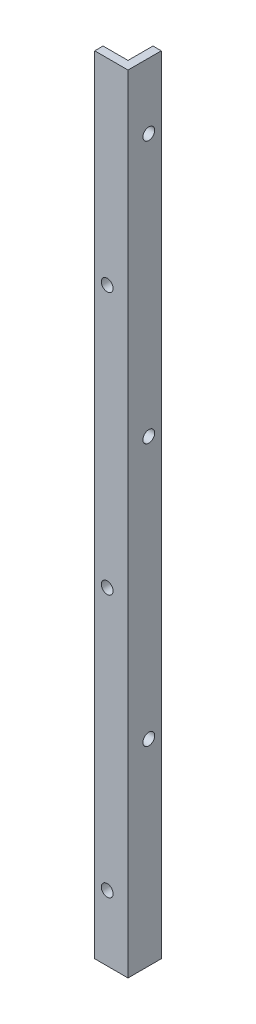
ISO-10303-21;
HEADER;
FILE_DESCRIPTION(('STEP AP214'),'2;1');
FILE_NAME('part.step','',(''),(''),'','','');
FILE_SCHEMA(('AUTOMOTIVE_DESIGN { 1 0 10303 214 1 1 1 1 }'));
ENDSEC;
DATA;
#1=APPLICATION_CONTEXT('core data for automotive mechanical design processes');
#2=APPLICATION_PROTOCOL_DEFINITION('international standard','automotive_design',2000,#1);
#3=PRODUCT_CONTEXT('',#1,'mechanical');
#4=PRODUCT('Part','Part','',(#3));
#5=PRODUCT_RELATED_PRODUCT_CATEGORY('part','',(#4));
#6=PRODUCT_DEFINITION_FORMATION('','',#4);
#7=PRODUCT_DEFINITION_CONTEXT('part definition',#1,'design');
#8=PRODUCT_DEFINITION('design','',#6,#7);
#9=PRODUCT_DEFINITION_SHAPE('','',#8);
#10=(LENGTH_UNIT() NAMED_UNIT(*) SI_UNIT(.MILLI.,.METRE.));
#11=(NAMED_UNIT(*) PLANE_ANGLE_UNIT() SI_UNIT($,.RADIAN.));
#12=(NAMED_UNIT(*) SI_UNIT($,.STERADIAN.) SOLID_ANGLE_UNIT());
#13=UNCERTAINTY_MEASURE_WITH_UNIT(LENGTH_MEASURE(1.E-05),#10,'distance_accuracy_value','');
#14=(GEOMETRIC_REPRESENTATION_CONTEXT(3) GLOBAL_UNCERTAINTY_ASSIGNED_CONTEXT((#13)) GLOBAL_UNIT_ASSIGNED_CONTEXT((#10,
#11,#12)) REPRESENTATION_CONTEXT('',''));
#15=CARTESIAN_POINT('',(0.,0.,0.));
#16=DIRECTION('',(0.,0.,1.));
#17=DIRECTION('',(1.,0.,0.));
#18=AXIS2_PLACEMENT_3D('',#15,#16,#17);
#19=CARTESIAN_POINT('',(0.,300.,-3.18));
#20=DIRECTION('',(0.,0.,1.));
#21=DIRECTION('',(1.,0.,0.));
#22=AXIS2_PLACEMENT_3D('',#19,#20,#21);
#23=PLANE('',#22);
#24=CARTESIAN_POINT('',(-7.94000000000001,225.,-3.18));
#25=DIRECTION('',(0.,0.,-1.));
#26=DIRECTION('',(-1.,0.,0.));
#27=AXIS2_PLACEMENT_3D('',#24,#25,#26);
#28=CIRCLE('',#27,2.25);
#29=CARTESIAN_POINT('',(-10.19,225.,-3.18));
#30=VERTEX_POINT('',#29);
#31=EDGE_CURVE('E155',#30,#30,#28,.T.);
#32=ORIENTED_EDGE('',*,*,#31,.F.);
#33=EDGE_LOOP('',(#32));
#34=FACE_BOUND('',#33,.T.);
#35=CARTESIAN_POINT('',(-7.94000000000001,125.,-3.18));
#36=DIRECTION('',(0.,0.,-1.));
#37=DIRECTION('',(-1.,0.,0.));
#38=AXIS2_PLACEMENT_3D('',#35,#36,#37);
#39=CIRCLE('',#38,2.25);
#40=CARTESIAN_POINT('',(-10.19,125.,-3.18));
#41=VERTEX_POINT('',#40);
#42=EDGE_CURVE('E212',#41,#41,#39,.T.);
#43=ORIENTED_EDGE('',*,*,#42,.F.);
#44=EDGE_LOOP('',(#43));
#45=FACE_BOUND('',#44,.T.);
#46=CARTESIAN_POINT('',(-7.94000000000001,25.,-3.18));
#47=DIRECTION('',(0.,0.,-1.));
#48=DIRECTION('',(-1.,0.,0.));
#49=AXIS2_PLACEMENT_3D('',#46,#47,#48);
#50=CIRCLE('',#49,2.25);
#51=CARTESIAN_POINT('',(-10.19,25.,-3.18));
#52=VERTEX_POINT('',#51);
#53=EDGE_CURVE('E215',#52,#52,#50,.T.);
#54=ORIENTED_EDGE('',*,*,#53,.F.);
#55=EDGE_LOOP('',(#54));
#56=FACE_BOUND('',#55,.T.);
#57=DIRECTION('',(-1.,0.,0.));
#58=VECTOR('',#57,1.);
#59=CARTESIAN_POINT('',(0.,0.,-3.18));
#60=LINE('',#59,#58);
#61=CARTESIAN_POINT('',(-3.18,0.,-3.18));
#62=VERTEX_POINT('',#61);
#63=CARTESIAN_POINT('',(-12.7,0.,-3.18));
#64=VERTEX_POINT('',#63);
#65=EDGE_CURVE('E132',#62,#64,#60,.T.);
#66=ORIENTED_EDGE('',*,*,#65,.T.);
#67=DIRECTION('',(0.,-1.,0.));
#68=VECTOR('',#67,1.);
#69=CARTESIAN_POINT('',(-12.7,300.,-3.18));
#70=LINE('',#69,#68);
#71=CARTESIAN_POINT('',(-12.7,300.,-3.18));
#72=VERTEX_POINT('',#71);
#73=EDGE_CURVE('E11',#72,#64,#70,.T.);
#74=ORIENTED_EDGE('',*,*,#73,.F.);
#75=DIRECTION('',(-1.,0.,0.));
#76=VECTOR('',#75,1.);
#77=CARTESIAN_POINT('',(0.,300.,-3.18));
#78=LINE('',#77,#76);
#79=CARTESIAN_POINT('',(-3.18,300.,-3.18));
#80=VERTEX_POINT('',#79);
#81=EDGE_CURVE('E147',#80,#72,#78,.T.);
#82=ORIENTED_EDGE('',*,*,#81,.F.);
#83=DIRECTION('',(0.,-1.,0.));
#84=VECTOR('',#83,1.);
#85=CARTESIAN_POINT('',(-3.18,300.,-3.18));
#86=LINE('',#85,#84);
#87=EDGE_CURVE('E64',#80,#62,#86,.T.);
#88=ORIENTED_EDGE('',*,*,#87,.T.);
#89=EDGE_LOOP('',(#66,#74,#82,#88));
#90=FACE_BOUND('',#89,.T.);
#91=ADVANCED_FACE('F46',(#34,#45,#56,#90),#23,.F.);
#92=CARTESIAN_POINT('',(-12.7,300.,0.));
#93=DIRECTION('',(1.,0.,0.));
#94=DIRECTION('',(0.,0.,-1.));
#95=AXIS2_PLACEMENT_3D('',#92,#93,#94);
#96=PLANE('',#95);
#97=DIRECTION('',(0.,0.,1.));
#98=VECTOR('',#97,1.);
#99=CARTESIAN_POINT('',(-12.7,0.,0.));
#100=LINE('',#99,#98);
#101=CARTESIAN_POINT('',(-12.7,0.,0.));
#102=VERTEX_POINT('',#101);
#103=EDGE_CURVE('E134',#64,#102,#100,.T.);
#104=ORIENTED_EDGE('',*,*,#103,.T.);
#105=DIRECTION('',(0.,-1.,0.));
#106=VECTOR('',#105,1.);
#107=CARTESIAN_POINT('',(-12.7,300.,0.));
#108=LINE('',#107,#106);
#109=CARTESIAN_POINT('',(-12.7,300.,0.));
#110=VERTEX_POINT('',#109);
#111=EDGE_CURVE('E55',#110,#102,#108,.T.);
#112=ORIENTED_EDGE('',*,*,#111,.F.);
#113=DIRECTION('',(0.,0.,1.));
#114=VECTOR('',#113,1.);
#115=CARTESIAN_POINT('',(-12.7,300.,0.));
#116=LINE('',#115,#114);
#117=EDGE_CURVE('E96',#72,#110,#116,.T.);
#118=ORIENTED_EDGE('',*,*,#117,.F.);
#119=ORIENTED_EDGE('',*,*,#73,.T.);
#120=EDGE_LOOP('',(#104,#112,#118,#119));
#121=FACE_BOUND('',#120,.T.);
#122=ADVANCED_FACE('F201',(#121),#96,.F.);
#123=CARTESIAN_POINT('',(0.,300.,0.));
#124=DIRECTION('',(0.,0.,1.));
#125=DIRECTION('',(1.,0.,0.));
#126=AXIS2_PLACEMENT_3D('',#123,#124,#125);
#127=PLANE('',#126);
#128=CARTESIAN_POINT('',(-7.94000000000001,225.,0.));
#129=DIRECTION('',(0.,0.,1.));
#130=DIRECTION('',(1.,0.,0.));
#131=AXIS2_PLACEMENT_3D('',#128,#129,#130);
#132=CIRCLE('',#131,2.25);
#133=CARTESIAN_POINT('',(-5.69000000000001,225.,0.));
#134=VERTEX_POINT('',#133);
#135=EDGE_CURVE('E49',#134,#134,#132,.T.);
#136=ORIENTED_EDGE('',*,*,#135,.F.);
#137=EDGE_LOOP('',(#136));
#138=FACE_BOUND('',#137,.T.);
#139=CARTESIAN_POINT('',(-7.94000000000001,125.,0.));
#140=DIRECTION('',(0.,0.,1.));
#141=DIRECTION('',(1.,0.,0.));
#142=AXIS2_PLACEMENT_3D('',#139,#140,#141);
#143=CIRCLE('',#142,2.25);
#144=CARTESIAN_POINT('',(-5.69000000000001,125.,0.));
#145=VERTEX_POINT('',#144);
#146=EDGE_CURVE('E154',#145,#145,#143,.T.);
#147=ORIENTED_EDGE('',*,*,#146,.F.);
#148=EDGE_LOOP('',(#147));
#149=FACE_BOUND('',#148,.T.);
#150=CARTESIAN_POINT('',(-7.94000000000001,25.,0.));
#151=DIRECTION('',(0.,0.,1.));
#152=DIRECTION('',(1.,0.,0.));
#153=AXIS2_PLACEMENT_3D('',#150,#151,#152);
#154=CIRCLE('',#153,2.25);
#155=CARTESIAN_POINT('',(-5.69000000000001,25.,0.));
#156=VERTEX_POINT('',#155);
#157=EDGE_CURVE('E152',#156,#156,#154,.T.);
#158=ORIENTED_EDGE('',*,*,#157,.F.);
#159=EDGE_LOOP('',(#158));
#160=FACE_BOUND('',#159,.T.);
#161=DIRECTION('',(-1.,0.,0.));
#162=VECTOR('',#161,1.);
#163=CARTESIAN_POINT('',(0.,0.,0.));
#164=LINE('',#163,#162);
#165=CARTESIAN_POINT('',(0.,0.,0.));
#166=VERTEX_POINT('',#165);
#167=EDGE_CURVE('E138',#166,#102,#164,.T.);
#168=ORIENTED_EDGE('',*,*,#167,.F.);
#169=DIRECTION('',(0.,-1.,0.));
#170=VECTOR('',#169,1.);
#171=CARTESIAN_POINT('',(0.,300.,0.));
#172=LINE('',#171,#170);
#173=CARTESIAN_POINT('',(0.,300.,0.));
#174=VERTEX_POINT('',#173);
#175=EDGE_CURVE('E124',#174,#166,#172,.T.);
#176=ORIENTED_EDGE('',*,*,#175,.F.);
#177=DIRECTION('',(-1.,0.,0.));
#178=VECTOR('',#177,1.);
#179=CARTESIAN_POINT('',(0.,300.,0.));
#180=LINE('',#179,#178);
#181=EDGE_CURVE('E114',#174,#110,#180,.T.);
#182=ORIENTED_EDGE('',*,*,#181,.T.);
#183=ORIENTED_EDGE('',*,*,#111,.T.);
#184=EDGE_LOOP('',(#168,#176,#182,#183));
#185=FACE_BOUND('',#184,.T.);
#186=ADVANCED_FACE('F184',(#138,#149,#160,#185),#127,.T.);
#187=CARTESIAN_POINT('',(0.,300.,0.));
#188=DIRECTION('',(-1.,0.,0.));
#189=DIRECTION('',(0.,0.,1.));
#190=AXIS2_PLACEMENT_3D('',#187,#188,#189);
#191=PLANE('',#190);
#192=CARTESIAN_POINT('',(0.,275.,-7.94));
#193=DIRECTION('',(-1.,0.,0.));
#194=DIRECTION('',(0.,0.,1.));
#195=AXIS2_PLACEMENT_3D('',#192,#193,#194);
#196=CIRCLE('',#195,2.25);
#197=CARTESIAN_POINT('',(0.,275.,-5.68999999999999));
#198=VERTEX_POINT('',#197);
#199=EDGE_CURVE('E135',#198,#198,#196,.T.);
#200=ORIENTED_EDGE('',*,*,#199,.T.);
#201=EDGE_LOOP('',(#200));
#202=FACE_BOUND('',#201,.T.);
#203=CARTESIAN_POINT('',(0.,175.,-7.94));
#204=DIRECTION('',(-1.,0.,0.));
#205=DIRECTION('',(0.,0.,1.));
#206=AXIS2_PLACEMENT_3D('',#203,#204,#205);
#207=CIRCLE('',#206,2.25);
#208=CARTESIAN_POINT('',(0.,175.,-5.68999999999999));
#209=VERTEX_POINT('',#208);
#210=EDGE_CURVE('E176',#209,#209,#207,.T.);
#211=ORIENTED_EDGE('',*,*,#210,.T.);
#212=EDGE_LOOP('',(#211));
#213=FACE_BOUND('',#212,.T.);
#214=CARTESIAN_POINT('',(0.,75.,-7.94));
#215=DIRECTION('',(-1.,0.,0.));
#216=DIRECTION('',(0.,0.,1.));
#217=AXIS2_PLACEMENT_3D('',#214,#215,#216);
#218=CIRCLE('',#217,2.25);
#219=CARTESIAN_POINT('',(0.,75.,-5.68999999999999));
#220=VERTEX_POINT('',#219);
#221=EDGE_CURVE('E173',#220,#220,#218,.T.);
#222=ORIENTED_EDGE('',*,*,#221,.T.);
#223=EDGE_LOOP('',(#222));
#224=FACE_BOUND('',#223,.T.);
#225=DIRECTION('',(0.,0.,-1.));
#226=VECTOR('',#225,1.);
#227=CARTESIAN_POINT('',(0.,0.,0.));
#228=LINE('',#227,#226);
#229=CARTESIAN_POINT('',(0.,0.,-12.7));
#230=VERTEX_POINT('',#229);
#231=EDGE_CURVE('E121',#166,#230,#228,.T.);
#232=ORIENTED_EDGE('',*,*,#231,.T.);
#233=DIRECTION('',(0.,-1.,0.));
#234=VECTOR('',#233,1.);
#235=CARTESIAN_POINT('',(0.,300.,-12.7));
#236=LINE('',#235,#234);
#237=CARTESIAN_POINT('',(0.,300.,-12.7));
#238=VERTEX_POINT('',#237);
#239=EDGE_CURVE('E118',#238,#230,#236,.T.);
#240=ORIENTED_EDGE('',*,*,#239,.F.);
#241=DIRECTION('',(0.,0.,-1.));
#242=VECTOR('',#241,1.);
#243=CARTESIAN_POINT('',(0.,300.,0.));
#244=LINE('',#243,#242);
#245=EDGE_CURVE('E107',#174,#238,#244,.T.);
#246=ORIENTED_EDGE('',*,*,#245,.F.);
#247=ORIENTED_EDGE('',*,*,#175,.T.);
#248=EDGE_LOOP('',(#232,#240,#246,#247));
#249=FACE_BOUND('',#248,.T.);
#250=ADVANCED_FACE('F119',(#202,#213,#224,#249),#191,.F.);
#251=CARTESIAN_POINT('',(0.,300.,-12.7));
#252=DIRECTION('',(0.,0.,-1.));
#253=DIRECTION('',(-1.,0.,0.));
#254=AXIS2_PLACEMENT_3D('',#251,#252,#253);
#255=PLANE('',#254);
#256=DIRECTION('',(1.,0.,0.));
#257=VECTOR('',#256,1.);
#258=CARTESIAN_POINT('',(0.,0.,-12.7));
#259=LINE('',#258,#257);
#260=CARTESIAN_POINT('',(-3.18,0.,-12.7));
#261=VERTEX_POINT('',#260);
#262=EDGE_CURVE('E142',#261,#230,#259,.T.);
#263=ORIENTED_EDGE('',*,*,#262,.F.);
#264=DIRECTION('',(0.,-1.,0.));
#265=VECTOR('',#264,1.);
#266=CARTESIAN_POINT('',(-3.18,300.,-12.7));
#267=LINE('',#266,#265);
#268=CARTESIAN_POINT('',(-3.18,300.,-12.7));
#269=VERTEX_POINT('',#268);
#270=EDGE_CURVE('E84',#269,#261,#267,.T.);
#271=ORIENTED_EDGE('',*,*,#270,.F.);
#272=DIRECTION('',(1.,0.,0.));
#273=VECTOR('',#272,1.);
#274=CARTESIAN_POINT('',(0.,300.,-12.7));
#275=LINE('',#274,#273);
#276=EDGE_CURVE('E112',#269,#238,#275,.T.);
#277=ORIENTED_EDGE('',*,*,#276,.T.);
#278=ORIENTED_EDGE('',*,*,#239,.T.);
#279=EDGE_LOOP('',(#263,#271,#277,#278));
#280=FACE_BOUND('',#279,.T.);
#281=ADVANCED_FACE('F126',(#280),#255,.T.);
#282=CARTESIAN_POINT('',(-3.18,300.,0.));
#283=DIRECTION('',(-1.,0.,0.));
#284=DIRECTION('',(0.,0.,1.));
#285=AXIS2_PLACEMENT_3D('',#282,#283,#284);
#286=PLANE('',#285);
#287=CARTESIAN_POINT('',(-3.18,275.,-7.94));
#288=DIRECTION('',(-1.,0.,0.));
#289=DIRECTION('',(0.,0.,1.));
#290=AXIS2_PLACEMENT_3D('',#287,#288,#289);
#291=CIRCLE('',#290,2.25);
#292=CARTESIAN_POINT('',(-3.18,275.,-5.68999999999999));
#293=VERTEX_POINT('',#292);
#294=EDGE_CURVE('E169',#293,#293,#291,.T.);
#295=ORIENTED_EDGE('',*,*,#294,.F.);
#296=EDGE_LOOP('',(#295));
#297=FACE_BOUND('',#296,.T.);
#298=CARTESIAN_POINT('',(-3.18,175.,-7.94));
#299=DIRECTION('',(-1.,0.,0.));
#300=DIRECTION('',(0.,0.,1.));
#301=AXIS2_PLACEMENT_3D('',#298,#299,#300);
#302=CIRCLE('',#301,2.25);
#303=CARTESIAN_POINT('',(-3.18,175.,-5.68999999999999));
#304=VERTEX_POINT('',#303);
#305=EDGE_CURVE('E164',#304,#304,#302,.T.);
#306=ORIENTED_EDGE('',*,*,#305,.F.);
#307=EDGE_LOOP('',(#306));
#308=FACE_BOUND('',#307,.T.);
#309=CARTESIAN_POINT('',(-3.18,75.,-7.94));
#310=DIRECTION('',(-1.,0.,0.));
#311=DIRECTION('',(0.,0.,1.));
#312=AXIS2_PLACEMENT_3D('',#309,#310,#311);
#313=CIRCLE('',#312,2.25);
#314=CARTESIAN_POINT('',(-3.18,75.,-5.68999999999999));
#315=VERTEX_POINT('',#314);
#316=EDGE_CURVE('E160',#315,#315,#313,.T.);
#317=ORIENTED_EDGE('',*,*,#316,.F.);
#318=EDGE_LOOP('',(#317));
#319=FACE_BOUND('',#318,.T.);
#320=DIRECTION('',(0.,0.,-1.));
#321=VECTOR('',#320,1.);
#322=CARTESIAN_POINT('',(-3.18,0.,0.));
#323=LINE('',#322,#321);
#324=EDGE_CURVE('E144',#62,#261,#323,.T.);
#325=ORIENTED_EDGE('',*,*,#324,.F.);
#326=ORIENTED_EDGE('',*,*,#87,.F.);
#327=DIRECTION('',(0.,0.,-1.));
#328=VECTOR('',#327,1.);
#329=CARTESIAN_POINT('',(-3.18,300.,0.));
#330=LINE('',#329,#328);
#331=EDGE_CURVE('E127',#80,#269,#330,.T.);
#332=ORIENTED_EDGE('',*,*,#331,.T.);
#333=ORIENTED_EDGE('',*,*,#270,.T.);
#334=EDGE_LOOP('',(#325,#326,#332,#333));
#335=FACE_BOUND('',#334,.T.);
#336=ADVANCED_FACE('F187',(#297,#308,#319,#335),#286,.T.);
#337=CARTESIAN_POINT('',(0.,300.,0.));
#338=DIRECTION('',(0.,1.,0.));
#339=DIRECTION('',(0.,0.,1.));
#340=AXIS2_PLACEMENT_3D('',#337,#338,#339);
#341=PLANE('',#340);
#342=ORIENTED_EDGE('',*,*,#81,.T.);
#343=ORIENTED_EDGE('',*,*,#117,.T.);
#344=ORIENTED_EDGE('',*,*,#181,.F.);
#345=ORIENTED_EDGE('',*,*,#245,.T.);
#346=ORIENTED_EDGE('',*,*,#276,.F.);
#347=ORIENTED_EDGE('',*,*,#331,.F.);
#348=EDGE_LOOP('',(#342,#343,#344,#345,#346,#347));
#349=FACE_BOUND('',#348,.T.);
#350=ADVANCED_FACE('F109',(#349),#341,.T.);
#351=CARTESIAN_POINT('',(0.,0.,0.));
#352=DIRECTION('',(0.,1.,0.));
#353=DIRECTION('',(0.,0.,1.));
#354=AXIS2_PLACEMENT_3D('',#351,#352,#353);
#355=PLANE('',#354);
#356=ORIENTED_EDGE('',*,*,#65,.F.);
#357=ORIENTED_EDGE('',*,*,#324,.T.);
#358=ORIENTED_EDGE('',*,*,#262,.T.);
#359=ORIENTED_EDGE('',*,*,#231,.F.);
#360=ORIENTED_EDGE('',*,*,#167,.T.);
#361=ORIENTED_EDGE('',*,*,#103,.F.);
#362=EDGE_LOOP('',(#356,#357,#358,#359,#360,#361));
#363=FACE_BOUND('',#362,.T.);
#364=ADVANCED_FACE('F186',(#363),#355,.F.);
#365=CARTESIAN_POINT('',(6.82,75.,-7.94));
#366=DIRECTION('',(-1.,0.,0.));
#367=DIRECTION('',(0.,0.,1.));
#368=AXIS2_PLACEMENT_3D('',#365,#366,#367);
#369=CYLINDRICAL_SURFACE('',#368,2.25);
#370=ORIENTED_EDGE('',*,*,#316,.T.);
#371=EDGE_LOOP('',(#370));
#372=FACE_BOUND('',#371,.T.);
#373=ORIENTED_EDGE('',*,*,#221,.F.);
#374=EDGE_LOOP('',(#373));
#375=FACE_BOUND('',#374,.T.);
#376=ADVANCED_FACE('F238',(#372,#375),#369,.F.);
#377=CARTESIAN_POINT('',(6.82,175.,-7.94));
#378=DIRECTION('',(-1.,0.,0.));
#379=DIRECTION('',(0.,0.,1.));
#380=AXIS2_PLACEMENT_3D('',#377,#378,#379);
#381=CYLINDRICAL_SURFACE('',#380,2.25);
#382=ORIENTED_EDGE('',*,*,#305,.T.);
#383=EDGE_LOOP('',(#382));
#384=FACE_BOUND('',#383,.T.);
#385=ORIENTED_EDGE('',*,*,#210,.F.);
#386=EDGE_LOOP('',(#385));
#387=FACE_BOUND('',#386,.T.);
#388=ADVANCED_FACE('F227',(#384,#387),#381,.F.);
#389=CARTESIAN_POINT('',(6.82,275.,-7.94));
#390=DIRECTION('',(-1.,0.,0.));
#391=DIRECTION('',(0.,0.,1.));
#392=AXIS2_PLACEMENT_3D('',#389,#390,#391);
#393=CYLINDRICAL_SURFACE('',#392,2.25);
#394=ORIENTED_EDGE('',*,*,#294,.T.);
#395=EDGE_LOOP('',(#394));
#396=FACE_BOUND('',#395,.T.);
#397=ORIENTED_EDGE('',*,*,#199,.F.);
#398=EDGE_LOOP('',(#397));
#399=FACE_BOUND('',#398,.T.);
#400=ADVANCED_FACE('F223',(#396,#399),#393,.F.);
#401=CARTESIAN_POINT('',(-7.94000000000001,25.,6.82));
#402=DIRECTION('',(0.,0.,-1.));
#403=DIRECTION('',(-1.,0.,0.));
#404=AXIS2_PLACEMENT_3D('',#401,#402,#403);
#405=CYLINDRICAL_SURFACE('',#404,2.25);
#406=ORIENTED_EDGE('',*,*,#157,.T.);
#407=EDGE_LOOP('',(#406));
#408=FACE_BOUND('',#407,.T.);
#409=ORIENTED_EDGE('',*,*,#53,.T.);
#410=EDGE_LOOP('',(#409));
#411=FACE_BOUND('',#410,.T.);
#412=ADVANCED_FACE('F226',(#408,#411),#405,.F.);
#413=CARTESIAN_POINT('',(-7.94000000000001,125.,6.82));
#414=DIRECTION('',(0.,0.,-1.));
#415=DIRECTION('',(-1.,0.,0.));
#416=AXIS2_PLACEMENT_3D('',#413,#414,#415);
#417=CYLINDRICAL_SURFACE('',#416,2.25);
#418=ORIENTED_EDGE('',*,*,#146,.T.);
#419=EDGE_LOOP('',(#418));
#420=FACE_BOUND('',#419,.T.);
#421=ORIENTED_EDGE('',*,*,#42,.T.);
#422=EDGE_LOOP('',(#421));
#423=FACE_BOUND('',#422,.T.);
#424=ADVANCED_FACE('F250',(#420,#423),#417,.F.);
#425=CARTESIAN_POINT('',(-7.94000000000001,225.,6.82));
#426=DIRECTION('',(0.,0.,-1.));
#427=DIRECTION('',(-1.,0.,0.));
#428=AXIS2_PLACEMENT_3D('',#425,#426,#427);
#429=CYLINDRICAL_SURFACE('',#428,2.25);
#430=ORIENTED_EDGE('',*,*,#135,.T.);
#431=EDGE_LOOP('',(#430));
#432=FACE_BOUND('',#431,.T.);
#433=ORIENTED_EDGE('',*,*,#31,.T.);
#434=EDGE_LOOP('',(#433));
#435=FACE_BOUND('',#434,.T.);
#436=ADVANCED_FACE('F254',(#432,#435),#429,.F.);
#437=CLOSED_SHELL('',(#91,#122,#186,#250,#281,#336,#350,#364,#376,#388,#400,#412,#424,#436));
#438=MANIFOLD_SOLID_BREP('B2',#437);
#439=ADVANCED_BREP_SHAPE_REPRESENTATION('',(#18,#438),#14);
#440=SHAPE_DEFINITION_REPRESENTATION(#9,#439);
ENDSEC;
END-ISO-10303-21;
